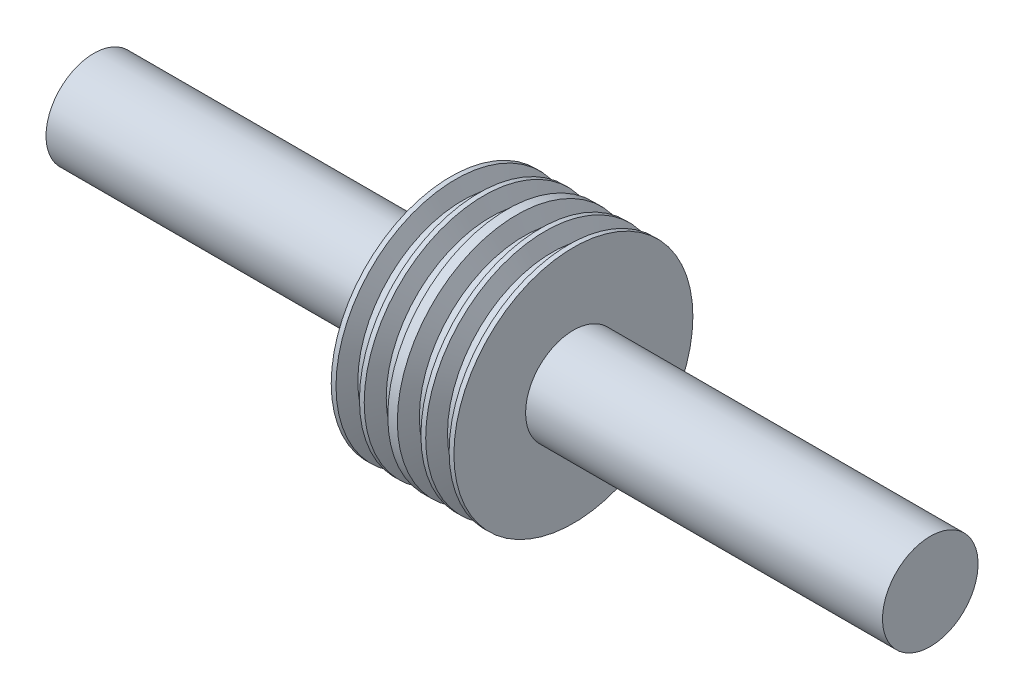
ISO-10303-21;
HEADER;
FILE_DESCRIPTION(('STEP AP214'),'2;1');
FILE_NAME('part.step','',(''),(''),'','','');
FILE_SCHEMA(('AUTOMOTIVE_DESIGN { 1 0 10303 214 1 1 1 1 }'));
ENDSEC;
DATA;
#1=APPLICATION_CONTEXT('core data for automotive mechanical design processes');
#2=APPLICATION_PROTOCOL_DEFINITION('international standard','automotive_design',2000,#1);
#3=PRODUCT_CONTEXT('',#1,'mechanical');
#4=PRODUCT('Part','Part','',(#3));
#5=PRODUCT_RELATED_PRODUCT_CATEGORY('part','',(#4));
#6=PRODUCT_DEFINITION_FORMATION('','',#4);
#7=PRODUCT_DEFINITION_CONTEXT('part definition',#1,'design');
#8=PRODUCT_DEFINITION('design','',#6,#7);
#9=PRODUCT_DEFINITION_SHAPE('','',#8);
#10=(LENGTH_UNIT() NAMED_UNIT(*) SI_UNIT(.MILLI.,.METRE.));
#11=(NAMED_UNIT(*) PLANE_ANGLE_UNIT() SI_UNIT($,.RADIAN.));
#12=(NAMED_UNIT(*) SI_UNIT($,.STERADIAN.) SOLID_ANGLE_UNIT());
#13=UNCERTAINTY_MEASURE_WITH_UNIT(LENGTH_MEASURE(1.E-05),#10,'distance_accuracy_value','');
#14=(GEOMETRIC_REPRESENTATION_CONTEXT(3) GLOBAL_UNCERTAINTY_ASSIGNED_CONTEXT((#13)) GLOBAL_UNIT_ASSIGNED_CONTEXT((#10,
#11,#12)) REPRESENTATION_CONTEXT('',''));
#15=CARTESIAN_POINT('',(0.,0.,0.));
#16=DIRECTION('',(0.,0.,1.));
#17=DIRECTION('',(1.,0.,0.));
#18=AXIS2_PLACEMENT_3D('',#15,#16,#17);
#19=CARTESIAN_POINT('',(35.4,0.,0.));
#20=DIRECTION('',(-1.,0.,0.));
#21=DIRECTION('',(0.,0.,1.));
#22=AXIS2_PLACEMENT_3D('',#19,#20,#21);
#23=CONICAL_SURFACE('',#22,10.,1.13446401379632);
#24=CARTESIAN_POINT('',(35.9858967597656,0.,0.));
#25=DIRECTION('',(-1.,0.,0.));
#26=DIRECTION('',(0.,0.,1.));
#27=AXIS2_PLACEMENT_3D('',#24,#25,#26);
#28=CIRCLE('',#27,8.74354034397835);
#29=CARTESIAN_POINT('',(35.9858967597656,0.,8.74354034397835));
#30=VERTEX_POINT('',#29);
#31=EDGE_CURVE('E113',#30,#30,#28,.T.);
#32=ORIENTED_EDGE('',*,*,#31,.T.);
#33=EDGE_LOOP('',(#32));
#34=FACE_BOUND('',#33,.T.);
#35=CARTESIAN_POINT('',(35.4,0.,0.));
#36=DIRECTION('',(-1.,0.,0.));
#37=DIRECTION('',(0.,0.,1.));
#38=AXIS2_PLACEMENT_3D('',#35,#36,#37);
#39=CIRCLE('',#38,10.);
#40=CARTESIAN_POINT('',(35.4,0.,10.));
#41=VERTEX_POINT('',#40);
#42=EDGE_CURVE('E10',#41,#41,#39,.T.);
#43=ORIENTED_EDGE('',*,*,#42,.F.);
#44=EDGE_LOOP('',(#43));
#45=FACE_BOUND('',#44,.T.);
#46=ADVANCED_FACE('F43',(#34,#45),#23,.T.);
#47=CARTESIAN_POINT('',(0.,0.,0.));
#48=DIRECTION('',(-1.,0.,0.));
#49=DIRECTION('',(0.,0.,1.));
#50=AXIS2_PLACEMENT_3D('',#47,#48,#49);
#51=CYLINDRICAL_SURFACE('',#50,10.);
#52=CARTESIAN_POINT('',(34.6,0.,0.));
#53=DIRECTION('',(-1.,0.,0.));
#54=DIRECTION('',(0.,0.,1.));
#55=AXIS2_PLACEMENT_3D('',#52,#53,#54);
#56=CIRCLE('',#55,10.);
#57=CARTESIAN_POINT('',(34.6,0.,10.));
#58=VERTEX_POINT('',#57);
#59=EDGE_CURVE('E49',#58,#58,#56,.T.);
#60=ORIENTED_EDGE('',*,*,#59,.F.);
#61=EDGE_LOOP('',(#60));
#62=FACE_BOUND('',#61,.T.);
#63=ORIENTED_EDGE('',*,*,#42,.T.);
#64=EDGE_LOOP('',(#63));
#65=FACE_BOUND('',#64,.T.);
#66=ADVANCED_FACE('F131',(#62,#65),#51,.T.);
#67=CARTESIAN_POINT('',(34.6,0.,0.));
#68=DIRECTION('',(1.,0.,0.));
#69=DIRECTION('',(0.,0.,-1.));
#70=AXIS2_PLACEMENT_3D('',#67,#68,#69);
#71=CONICAL_SURFACE('',#70,10.,1.13446401379632);
#72=CARTESIAN_POINT('',(34.0141032402343,0.,0.));
#73=DIRECTION('',(-1.,0.,0.));
#74=DIRECTION('',(0.,0.,1.));
#75=AXIS2_PLACEMENT_3D('',#72,#73,#74);
#76=CIRCLE('',#75,8.74354034397821);
#77=CARTESIAN_POINT('',(34.0141032402343,0.,8.74354034397821));
#78=VERTEX_POINT('',#77);
#79=EDGE_CURVE('E53',#78,#78,#76,.T.);
#80=ORIENTED_EDGE('',*,*,#79,.F.);
#81=EDGE_LOOP('',(#80));
#82=FACE_BOUND('',#81,.T.);
#83=ORIENTED_EDGE('',*,*,#59,.T.);
#84=EDGE_LOOP('',(#83));
#85=FACE_BOUND('',#84,.T.);
#86=ADVANCED_FACE('F135',(#82,#85),#71,.T.);
#87=CARTESIAN_POINT('',(0.,0.,0.));
#88=DIRECTION('',(-1.,0.,0.));
#89=DIRECTION('',(0.,0.,1.));
#90=AXIS2_PLACEMENT_3D('',#87,#88,#89);
#91=CYLINDRICAL_SURFACE('',#90,8.74354034397821);
#92=CARTESIAN_POINT('',(33.2141032402343,0.,0.));
#93=DIRECTION('',(-1.,0.,0.));
#94=DIRECTION('',(0.,0.,1.));
#95=AXIS2_PLACEMENT_3D('',#92,#93,#94);
#96=CIRCLE('',#95,8.7435403439782);
#97=CARTESIAN_POINT('',(33.2141032402343,0.,8.7435403439782));
#98=VERTEX_POINT('',#97);
#99=EDGE_CURVE('E57',#98,#98,#96,.T.);
#100=ORIENTED_EDGE('',*,*,#99,.F.);
#101=EDGE_LOOP('',(#100));
#102=FACE_BOUND('',#101,.T.);
#103=ORIENTED_EDGE('',*,*,#79,.T.);
#104=EDGE_LOOP('',(#103));
#105=FACE_BOUND('',#104,.T.);
#106=ADVANCED_FACE('F140',(#102,#105),#91,.T.);
#107=CARTESIAN_POINT('',(33.2141032402343,0.,0.));
#108=DIRECTION('',(-1.,0.,0.));
#109=DIRECTION('',(0.,0.,1.));
#110=AXIS2_PLACEMENT_3D('',#107,#108,#109);
#111=CONICAL_SURFACE('',#110,8.7435403439782,1.13446401379632);
#112=CARTESIAN_POINT('',(32.6282064804686,0.,0.));
#113=DIRECTION('',(-1.,0.,0.));
#114=DIRECTION('',(0.,0.,1.));
#115=AXIS2_PLACEMENT_3D('',#112,#113,#114);
#116=CIRCLE('',#115,10.);
#117=CARTESIAN_POINT('',(32.6282064804686,0.,10.));
#118=VERTEX_POINT('',#117);
#119=EDGE_CURVE('E62',#118,#118,#116,.T.);
#120=ORIENTED_EDGE('',*,*,#119,.F.);
#121=EDGE_LOOP('',(#120));
#122=FACE_BOUND('',#121,.T.);
#123=ORIENTED_EDGE('',*,*,#99,.T.);
#124=EDGE_LOOP('',(#123));
#125=FACE_BOUND('',#124,.T.);
#126=ADVANCED_FACE('F146',(#122,#125),#111,.T.);
#127=CARTESIAN_POINT('',(0.,0.,0.));
#128=DIRECTION('',(-1.,0.,0.));
#129=DIRECTION('',(0.,0.,1.));
#130=AXIS2_PLACEMENT_3D('',#127,#128,#129);
#131=CYLINDRICAL_SURFACE('',#130,10.);
#132=CARTESIAN_POINT('',(32.2282064804685,0.,0.));
#133=DIRECTION('',(-1.,0.,0.));
#134=DIRECTION('',(0.,0.,1.));
#135=AXIS2_PLACEMENT_3D('',#132,#133,#134);
#136=CIRCLE('',#135,10.);
#137=CARTESIAN_POINT('',(32.2282064804685,0.,10.));
#138=VERTEX_POINT('',#137);
#139=EDGE_CURVE('E65',#138,#138,#136,.T.);
#140=ORIENTED_EDGE('',*,*,#139,.F.);
#141=EDGE_LOOP('',(#140));
#142=FACE_BOUND('',#141,.T.);
#143=ORIENTED_EDGE('',*,*,#119,.T.);
#144=EDGE_LOOP('',(#143));
#145=FACE_BOUND('',#144,.T.);
#146=ADVANCED_FACE('F150',(#142,#145),#131,.T.);
#147=CARTESIAN_POINT('',(32.2282064804685,0.,0.));
#148=DIRECTION('',(1.,0.,0.));
#149=DIRECTION('',(0.,0.,-1.));
#150=AXIS2_PLACEMENT_3D('',#147,#148,#149);
#151=CONICAL_SURFACE('',#150,10.,1.13446401379632);
#152=CARTESIAN_POINT('',(31.6475564051128,0.,0.));
#153=DIRECTION('',(-1.,0.,0.));
#154=DIRECTION('',(0.,0.,1.));
#155=AXIS2_PLACEMENT_3D('',#152,#153,#154);
#156=CIRCLE('',#155,8.75479189500515);
#157=CARTESIAN_POINT('',(31.6475564051128,0.,8.75479189500515));
#158=VERTEX_POINT('',#157);
#159=EDGE_CURVE('E68',#158,#158,#156,.T.);
#160=ORIENTED_EDGE('',*,*,#159,.F.);
#161=EDGE_LOOP('',(#160));
#162=FACE_BOUND('',#161,.T.);
#163=ORIENTED_EDGE('',*,*,#139,.T.);
#164=EDGE_LOOP('',(#163));
#165=FACE_BOUND('',#164,.T.);
#166=ADVANCED_FACE('F154',(#162,#165),#151,.T.);
#167=CARTESIAN_POINT('',(0.,0.,0.));
#168=DIRECTION('',(-1.,0.,0.));
#169=DIRECTION('',(0.,0.,1.));
#170=AXIS2_PLACEMENT_3D('',#167,#168,#169);
#171=CYLINDRICAL_SURFACE('',#170,8.75479189500515);
#172=CARTESIAN_POINT('',(30.8475564051128,0.,0.));
#173=DIRECTION('',(-1.,0.,0.));
#174=DIRECTION('',(0.,0.,1.));
#175=AXIS2_PLACEMENT_3D('',#172,#173,#174);
#176=CIRCLE('',#175,8.75479189500515);
#177=CARTESIAN_POINT('',(30.8475564051128,0.,8.75479189500515));
#178=VERTEX_POINT('',#177);
#179=EDGE_CURVE('E71',#178,#178,#176,.T.);
#180=ORIENTED_EDGE('',*,*,#179,.F.);
#181=EDGE_LOOP('',(#180));
#182=FACE_BOUND('',#181,.T.);
#183=ORIENTED_EDGE('',*,*,#159,.T.);
#184=EDGE_LOOP('',(#183));
#185=FACE_BOUND('',#184,.T.);
#186=ADVANCED_FACE('F158',(#182,#185),#171,.T.);
#187=CARTESIAN_POINT('',(30.8475564051128,0.,0.));
#188=DIRECTION('',(-1.,0.,0.));
#189=DIRECTION('',(0.,0.,1.));
#190=AXIS2_PLACEMENT_3D('',#187,#188,#189);
#191=CONICAL_SURFACE('',#190,8.75479189500515,1.13446401379632);
#192=CARTESIAN_POINT('',(30.266906329757,0.,0.));
#193=DIRECTION('',(-1.,0.,0.));
#194=DIRECTION('',(0.,0.,1.));
#195=AXIS2_PLACEMENT_3D('',#192,#193,#194);
#196=CIRCLE('',#195,10.);
#197=CARTESIAN_POINT('',(30.266906329757,0.,10.));
#198=VERTEX_POINT('',#197);
#199=EDGE_CURVE('E74',#198,#198,#196,.T.);
#200=ORIENTED_EDGE('',*,*,#199,.F.);
#201=EDGE_LOOP('',(#200));
#202=FACE_BOUND('',#201,.T.);
#203=ORIENTED_EDGE('',*,*,#179,.T.);
#204=EDGE_LOOP('',(#203));
#205=FACE_BOUND('',#204,.T.);
#206=ADVANCED_FACE('F162',(#202,#205),#191,.T.);
#207=CARTESIAN_POINT('',(0.,0.,0.));
#208=DIRECTION('',(-1.,0.,0.));
#209=DIRECTION('',(0.,0.,1.));
#210=AXIS2_PLACEMENT_3D('',#207,#208,#209);
#211=CYLINDRICAL_SURFACE('',#210,10.);
#212=CARTESIAN_POINT('',(29.8669063297571,0.,0.));
#213=DIRECTION('',(-1.,0.,0.));
#214=DIRECTION('',(0.,0.,1.));
#215=AXIS2_PLACEMENT_3D('',#212,#213,#214);
#216=CIRCLE('',#215,10.);
#217=CARTESIAN_POINT('',(29.8669063297571,0.,10.));
#218=VERTEX_POINT('',#217);
#219=EDGE_CURVE('E77',#218,#218,#216,.T.);
#220=ORIENTED_EDGE('',*,*,#219,.F.);
#221=EDGE_LOOP('',(#220));
#222=FACE_BOUND('',#221,.T.);
#223=ORIENTED_EDGE('',*,*,#199,.T.);
#224=EDGE_LOOP('',(#223));
#225=FACE_BOUND('',#224,.T.);
#226=ADVANCED_FACE('F166',(#222,#225),#211,.T.);
#227=CARTESIAN_POINT('',(29.8669063297571,0.,0.));
#228=DIRECTION('',(1.,0.,0.));
#229=DIRECTION('',(0.,0.,-1.));
#230=AXIS2_PLACEMENT_3D('',#227,#228,#229);
#231=PLANE('',#230);
#232=CARTESIAN_POINT('',(29.8669063297571,0.,0.));
#233=DIRECTION('',(-1.,0.,0.));
#234=DIRECTION('',(0.,0.,1.));
#235=AXIS2_PLACEMENT_3D('',#232,#233,#234);
#236=CIRCLE('',#235,4.);
#237=CARTESIAN_POINT('',(29.8669063297571,0.,4.));
#238=VERTEX_POINT('',#237);
#239=EDGE_CURVE('E80',#238,#238,#236,.T.);
#240=ORIENTED_EDGE('',*,*,#239,.F.);
#241=EDGE_LOOP('',(#240));
#242=FACE_BOUND('',#241,.T.);
#243=ORIENTED_EDGE('',*,*,#219,.T.);
#244=EDGE_LOOP('',(#243));
#245=FACE_BOUND('',#244,.T.);
#246=ADVANCED_FACE('F170',(#242,#245),#231,.F.);
#247=CARTESIAN_POINT('',(0.,0.,0.));
#248=DIRECTION('',(-1.,0.,0.));
#249=DIRECTION('',(0.,0.,1.));
#250=AXIS2_PLACEMENT_3D('',#247,#248,#249);
#251=CYLINDRICAL_SURFACE('',#250,4.);
#252=CARTESIAN_POINT('',(0.,0.,0.));
#253=DIRECTION('',(-1.,0.,0.));
#254=DIRECTION('',(0.,0.,1.));
#255=AXIS2_PLACEMENT_3D('',#252,#253,#254);
#256=CIRCLE('',#255,4.);
#257=CARTESIAN_POINT('',(0.,0.,4.));
#258=VERTEX_POINT('',#257);
#259=EDGE_CURVE('E83',#258,#258,#256,.T.);
#260=ORIENTED_EDGE('',*,*,#259,.F.);
#261=EDGE_LOOP('',(#260));
#262=FACE_BOUND('',#261,.T.);
#263=ORIENTED_EDGE('',*,*,#239,.T.);
#264=EDGE_LOOP('',(#263));
#265=FACE_BOUND('',#264,.T.);
#266=ADVANCED_FACE('F174',(#262,#265),#251,.T.);
#267=CARTESIAN_POINT('',(0.,0.,0.));
#268=DIRECTION('',(1.,0.,0.));
#269=DIRECTION('',(0.,0.,-1.));
#270=AXIS2_PLACEMENT_3D('',#267,#268,#269);
#271=PLANE('',#270);
#272=ORIENTED_EDGE('',*,*,#259,.T.);
#273=EDGE_LOOP('',(#272));
#274=FACE_BOUND('',#273,.T.);
#275=ADVANCED_FACE('F178',(#274),#271,.F.);
#276=CARTESIAN_POINT('',(70.,0.,0.));
#277=DIRECTION('',(-1.,0.,0.));
#278=DIRECTION('',(0.,0.,1.));
#279=AXIS2_PLACEMENT_3D('',#276,#277,#278);
#280=PLANE('',#279);
#281=CARTESIAN_POINT('',(70.,0.,0.));
#282=DIRECTION('',(-1.,0.,0.));
#283=DIRECTION('',(0.,0.,1.));
#284=AXIS2_PLACEMENT_3D('',#281,#282,#283);
#285=CIRCLE('',#284,4.00000000000001);
#286=CARTESIAN_POINT('',(70.,0.,4.00000000000001));
#287=VERTEX_POINT('',#286);
#288=EDGE_CURVE('E86',#287,#287,#285,.T.);
#289=ORIENTED_EDGE('',*,*,#288,.F.);
#290=EDGE_LOOP('',(#289));
#291=FACE_BOUND('',#290,.T.);
#292=ADVANCED_FACE('F182',(#291),#280,.F.);
#293=CARTESIAN_POINT('',(0.,0.,0.));
#294=DIRECTION('',(-1.,0.,0.));
#295=DIRECTION('',(0.,0.,1.));
#296=AXIS2_PLACEMENT_3D('',#293,#294,#295);
#297=CYLINDRICAL_SURFACE('',#296,4.00000000000001);
#298=CARTESIAN_POINT('',(40.1330936702429,0.,0.));
#299=DIRECTION('',(-1.,0.,0.));
#300=DIRECTION('',(0.,0.,1.));
#301=AXIS2_PLACEMENT_3D('',#298,#299,#300);
#302=CIRCLE('',#301,4.00000000000001);
#303=CARTESIAN_POINT('',(40.1330936702429,0.,4.00000000000001));
#304=VERTEX_POINT('',#303);
#305=EDGE_CURVE('E89',#304,#304,#302,.T.);
#306=ORIENTED_EDGE('',*,*,#305,.F.);
#307=EDGE_LOOP('',(#306));
#308=FACE_BOUND('',#307,.T.);
#309=ORIENTED_EDGE('',*,*,#288,.T.);
#310=EDGE_LOOP('',(#309));
#311=FACE_BOUND('',#310,.T.);
#312=ADVANCED_FACE('F186',(#308,#311),#297,.T.);
#313=CARTESIAN_POINT('',(40.1330936702429,0.,0.));
#314=DIRECTION('',(-1.,0.,0.));
#315=DIRECTION('',(0.,0.,1.));
#316=AXIS2_PLACEMENT_3D('',#313,#314,#315);
#317=PLANE('',#316);
#318=CARTESIAN_POINT('',(40.1330936702429,0.,0.));
#319=DIRECTION('',(-1.,0.,0.));
#320=DIRECTION('',(0.,0.,1.));
#321=AXIS2_PLACEMENT_3D('',#318,#319,#320);
#322=CIRCLE('',#321,10.);
#323=CARTESIAN_POINT('',(40.1330936702429,0.,10.));
#324=VERTEX_POINT('',#323);
#325=EDGE_CURVE('E92',#324,#324,#322,.T.);
#326=ORIENTED_EDGE('',*,*,#325,.F.);
#327=EDGE_LOOP('',(#326));
#328=FACE_BOUND('',#327,.T.);
#329=ORIENTED_EDGE('',*,*,#305,.T.);
#330=EDGE_LOOP('',(#329));
#331=FACE_BOUND('',#330,.T.);
#332=ADVANCED_FACE('F190',(#328,#331),#317,.F.);
#333=CARTESIAN_POINT('',(0.,0.,0.));
#334=DIRECTION('',(-1.,0.,0.));
#335=DIRECTION('',(0.,0.,1.));
#336=AXIS2_PLACEMENT_3D('',#333,#334,#335);
#337=CYLINDRICAL_SURFACE('',#336,10.);
#338=ORIENTED_EDGE('',*,*,#325,.T.);
#339=EDGE_LOOP('',(#338));
#340=FACE_BOUND('',#339,.T.);
#341=CARTESIAN_POINT('',(39.7330936702428,0.,0.));
#342=DIRECTION('',(-1.,0.,0.));
#343=DIRECTION('',(0.,0.,1.));
#344=AXIS2_PLACEMENT_3D('',#341,#342,#343);
#345=CIRCLE('',#344,10.);
#346=CARTESIAN_POINT('',(39.7330936702428,0.,10.));
#347=VERTEX_POINT('',#346);
#348=EDGE_CURVE('E95',#347,#347,#345,.T.);
#349=ORIENTED_EDGE('',*,*,#348,.F.);
#350=EDGE_LOOP('',(#349));
#351=FACE_BOUND('',#350,.T.);
#352=ADVANCED_FACE('F194',(#340,#351),#337,.T.);
#353=CARTESIAN_POINT('',(39.1524435948871,0.,0.));
#354=DIRECTION('',(1.,0.,0.));
#355=DIRECTION('',(0.,0.,-1.));
#356=AXIS2_PLACEMENT_3D('',#353,#354,#355);
#357=CONICAL_SURFACE('',#356,8.75479189500517,1.13446401379633);
#358=ORIENTED_EDGE('',*,*,#348,.T.);
#359=EDGE_LOOP('',(#358));
#360=FACE_BOUND('',#359,.T.);
#361=CARTESIAN_POINT('',(39.1524435948871,0.,0.));
#362=DIRECTION('',(-1.,0.,0.));
#363=DIRECTION('',(0.,0.,1.));
#364=AXIS2_PLACEMENT_3D('',#361,#362,#363);
#365=CIRCLE('',#364,8.75479189500517);
#366=CARTESIAN_POINT('',(39.1524435948871,0.,8.75479189500517));
#367=VERTEX_POINT('',#366);
#368=EDGE_CURVE('E98',#367,#367,#365,.T.);
#369=ORIENTED_EDGE('',*,*,#368,.F.);
#370=EDGE_LOOP('',(#369));
#371=FACE_BOUND('',#370,.T.);
#372=ADVANCED_FACE('F198',(#360,#371),#357,.T.);
#373=CARTESIAN_POINT('',(0.,0.,0.));
#374=DIRECTION('',(-1.,0.,0.));
#375=DIRECTION('',(0.,0.,1.));
#376=AXIS2_PLACEMENT_3D('',#373,#374,#375);
#377=CYLINDRICAL_SURFACE('',#376,8.75479189500517);
#378=ORIENTED_EDGE('',*,*,#368,.T.);
#379=EDGE_LOOP('',(#378));
#380=FACE_BOUND('',#379,.T.);
#381=CARTESIAN_POINT('',(38.3524435948871,0.,0.));
#382=DIRECTION('',(-1.,0.,0.));
#383=DIRECTION('',(0.,0.,1.));
#384=AXIS2_PLACEMENT_3D('',#381,#382,#383);
#385=CIRCLE('',#384,8.75479189500517);
#386=CARTESIAN_POINT('',(38.3524435948871,0.,8.75479189500517));
#387=VERTEX_POINT('',#386);
#388=EDGE_CURVE('E101',#387,#387,#385,.T.);
#389=ORIENTED_EDGE('',*,*,#388,.F.);
#390=EDGE_LOOP('',(#389));
#391=FACE_BOUND('',#390,.T.);
#392=ADVANCED_FACE('F202',(#380,#391),#377,.T.);
#393=CARTESIAN_POINT('',(37.7717935195313,0.,0.));
#394=DIRECTION('',(-1.,0.,0.));
#395=DIRECTION('',(0.,0.,1.));
#396=AXIS2_PLACEMENT_3D('',#393,#394,#395);
#397=CONICAL_SURFACE('',#396,10.,1.13446401379632);
#398=ORIENTED_EDGE('',*,*,#388,.T.);
#399=EDGE_LOOP('',(#398));
#400=FACE_BOUND('',#399,.T.);
#401=CARTESIAN_POINT('',(37.7717935195313,0.,0.));
#402=DIRECTION('',(-1.,0.,0.));
#403=DIRECTION('',(0.,0.,1.));
#404=AXIS2_PLACEMENT_3D('',#401,#402,#403);
#405=CIRCLE('',#404,10.);
#406=CARTESIAN_POINT('',(37.7717935195313,0.,10.));
#407=VERTEX_POINT('',#406);
#408=EDGE_CURVE('E104',#407,#407,#405,.T.);
#409=ORIENTED_EDGE('',*,*,#408,.F.);
#410=EDGE_LOOP('',(#409));
#411=FACE_BOUND('',#410,.T.);
#412=ADVANCED_FACE('F206',(#400,#411),#397,.T.);
#413=CARTESIAN_POINT('',(0.,0.,0.));
#414=DIRECTION('',(-1.,0.,0.));
#415=DIRECTION('',(0.,0.,1.));
#416=AXIS2_PLACEMENT_3D('',#413,#414,#415);
#417=CYLINDRICAL_SURFACE('',#416,10.);
#418=ORIENTED_EDGE('',*,*,#408,.T.);
#419=EDGE_LOOP('',(#418));
#420=FACE_BOUND('',#419,.T.);
#421=CARTESIAN_POINT('',(37.3717935195313,0.,0.));
#422=DIRECTION('',(-1.,0.,0.));
#423=DIRECTION('',(0.,0.,1.));
#424=AXIS2_PLACEMENT_3D('',#421,#422,#423);
#425=CIRCLE('',#424,10.);
#426=CARTESIAN_POINT('',(37.3717935195313,0.,10.));
#427=VERTEX_POINT('',#426);
#428=EDGE_CURVE('E107',#427,#427,#425,.T.);
#429=ORIENTED_EDGE('',*,*,#428,.F.);
#430=EDGE_LOOP('',(#429));
#431=FACE_BOUND('',#430,.T.);
#432=ADVANCED_FACE('F127',(#420,#431),#417,.T.);
#433=CARTESIAN_POINT('',(36.7858967597656,0.,0.));
#434=DIRECTION('',(1.,0.,0.));
#435=DIRECTION('',(0.,0.,-1.));
#436=AXIS2_PLACEMENT_3D('',#433,#434,#435);
#437=CONICAL_SURFACE('',#436,8.74354034397835,1.13446401379632);
#438=ORIENTED_EDGE('',*,*,#428,.T.);
#439=EDGE_LOOP('',(#438));
#440=FACE_BOUND('',#439,.T.);
#441=CARTESIAN_POINT('',(36.7858967597656,0.,0.));
#442=DIRECTION('',(-1.,0.,0.));
#443=DIRECTION('',(0.,0.,1.));
#444=AXIS2_PLACEMENT_3D('',#441,#442,#443);
#445=CIRCLE('',#444,8.74354034397835);
#446=CARTESIAN_POINT('',(36.7858967597656,0.,8.74354034397835));
#447=VERTEX_POINT('',#446);
#448=EDGE_CURVE('E110',#447,#447,#445,.T.);
#449=ORIENTED_EDGE('',*,*,#448,.F.);
#450=EDGE_LOOP('',(#449));
#451=FACE_BOUND('',#450,.T.);
#452=ADVANCED_FACE('F121',(#440,#451),#437,.T.);
#453=CARTESIAN_POINT('',(0.,0.,0.));
#454=DIRECTION('',(-1.,0.,0.));
#455=DIRECTION('',(0.,0.,1.));
#456=AXIS2_PLACEMENT_3D('',#453,#454,#455);
#457=CYLINDRICAL_SURFACE('',#456,8.74354034397835);
#458=ORIENTED_EDGE('',*,*,#448,.T.);
#459=EDGE_LOOP('',(#458));
#460=FACE_BOUND('',#459,.T.);
#461=ORIENTED_EDGE('',*,*,#31,.F.);
#462=EDGE_LOOP('',(#461));
#463=FACE_BOUND('',#462,.T.);
#464=ADVANCED_FACE('F119',(#460,#463),#457,.T.);
#465=CLOSED_SHELL('',(#46,#66,#86,#106,#126,#146,#166,#186,#206,#226,#246,#266,#275,#292,#312,
#332,#352,#372,#392,#412,#432,#452,#464));
#466=MANIFOLD_SOLID_BREP('B2',#465);
#467=ADVANCED_BREP_SHAPE_REPRESENTATION('',(#18,#466),#14);
#468=SHAPE_DEFINITION_REPRESENTATION(#9,#467);
ENDSEC;
END-ISO-10303-21;
